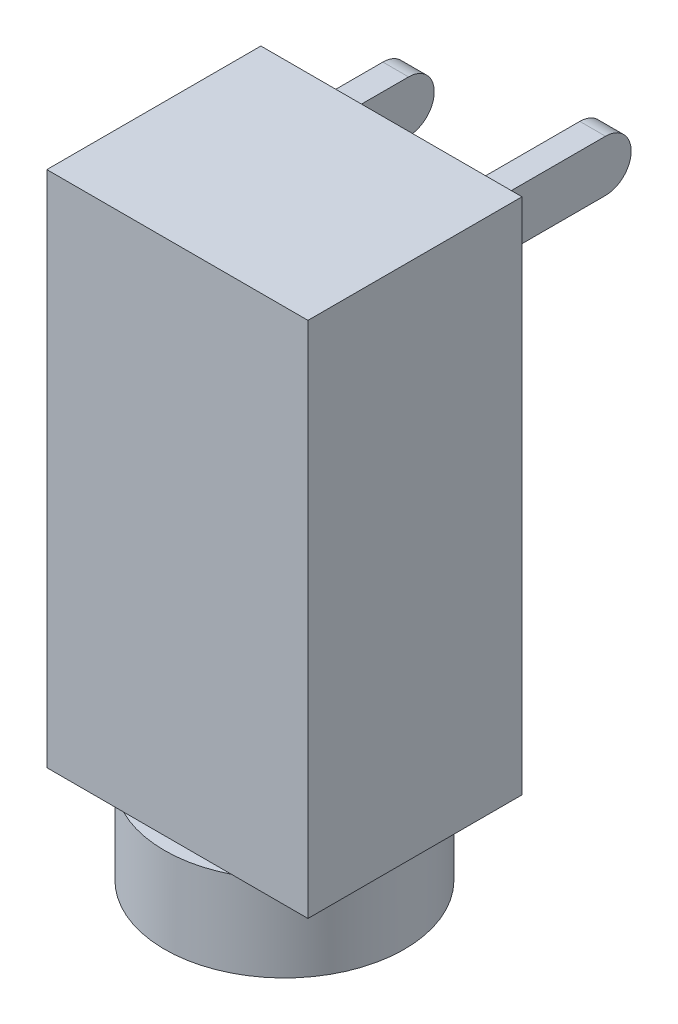
ISO-10303-21;
HEADER;
FILE_DESCRIPTION(('STEP AP214'),'2;1');
FILE_NAME('part.step','',(''),(''),'','','');
FILE_SCHEMA(('AUTOMOTIVE_DESIGN { 1 0 10303 214 1 1 1 1 }'));
ENDSEC;
DATA;
#1=APPLICATION_CONTEXT('core data for automotive mechanical design processes');
#2=APPLICATION_PROTOCOL_DEFINITION('international standard','automotive_design',2000,#1);
#3=PRODUCT_CONTEXT('',#1,'mechanical');
#4=PRODUCT('Part','Part','',(#3));
#5=PRODUCT_RELATED_PRODUCT_CATEGORY('part','',(#4));
#6=PRODUCT_DEFINITION_FORMATION('','',#4);
#7=PRODUCT_DEFINITION_CONTEXT('part definition',#1,'design');
#8=PRODUCT_DEFINITION('design','',#6,#7);
#9=PRODUCT_DEFINITION_SHAPE('','',#8);
#10=(LENGTH_UNIT() NAMED_UNIT(*) SI_UNIT(.MILLI.,.METRE.));
#11=(NAMED_UNIT(*) PLANE_ANGLE_UNIT() SI_UNIT($,.RADIAN.));
#12=(NAMED_UNIT(*) SI_UNIT($,.STERADIAN.) SOLID_ANGLE_UNIT());
#13=UNCERTAINTY_MEASURE_WITH_UNIT(LENGTH_MEASURE(1.E-05),#10,'distance_accuracy_value','');
#14=(GEOMETRIC_REPRESENTATION_CONTEXT(3) GLOBAL_UNCERTAINTY_ASSIGNED_CONTEXT((#13)) GLOBAL_UNIT_ASSIGNED_CONTEXT((#10,
#11,#12)) REPRESENTATION_CONTEXT('',''));
#15=CARTESIAN_POINT('',(0.,0.,0.));
#16=DIRECTION('',(0.,0.,1.));
#17=DIRECTION('',(1.,0.,0.));
#18=AXIS2_PLACEMENT_3D('',#15,#16,#17);
#19=CARTESIAN_POINT('',(0.,0.,0.));
#20=DIRECTION('',(0.,0.,1.));
#21=DIRECTION('',(1.,0.,0.));
#22=AXIS2_PLACEMENT_3D('',#19,#20,#21);
#23=PLANE('',#22);
#24=DIRECTION('',(0.,1.,0.));
#25=VECTOR('',#24,1.);
#26=CARTESIAN_POINT('',(-2.6,4.75,0.));
#27=LINE('',#26,#25);
#28=CARTESIAN_POINT('',(-2.6,3.55,0.));
#29=VERTEX_POINT('',#28);
#30=CARTESIAN_POINT('',(-2.6,4.75,0.));
#31=VERTEX_POINT('',#30);
#32=EDGE_CURVE('E240',#29,#31,#27,.T.);
#33=ORIENTED_EDGE('',*,*,#32,.F.);
#34=DIRECTION('',(-1.,0.,0.));
#35=VECTOR('',#34,1.);
#36=CARTESIAN_POINT('',(-2.,3.55,0.));
#37=LINE('',#36,#35);
#38=CARTESIAN_POINT('',(-2.,3.55,0.));
#39=VERTEX_POINT('',#38);
#40=EDGE_CURVE('E249',#39,#29,#37,.T.);
#41=ORIENTED_EDGE('',*,*,#40,.F.);
#42=DIRECTION('',(0.,-1.,0.));
#43=VECTOR('',#42,1.);
#44=CARTESIAN_POINT('',(-2.,4.75,0.));
#45=LINE('',#44,#43);
#46=CARTESIAN_POINT('',(-2.,4.75,0.));
#47=VERTEX_POINT('',#46);
#48=EDGE_CURVE('E246',#47,#39,#45,.T.);
#49=ORIENTED_EDGE('',*,*,#48,.F.);
#50=DIRECTION('',(1.,0.,0.));
#51=VECTOR('',#50,1.);
#52=CARTESIAN_POINT('',(-2.,4.75,0.));
#53=LINE('',#52,#51);
#54=EDGE_CURVE('E243',#31,#47,#53,.T.);
#55=ORIENTED_EDGE('',*,*,#54,.F.);
#56=EDGE_LOOP('',(#33,#41,#49,#55));
#57=FACE_BOUND('',#56,.T.);
#58=DIRECTION('',(0.,1.,0.));
#59=VECTOR('',#58,1.);
#60=CARTESIAN_POINT('',(-2.6,-2.25,0.));
#61=LINE('',#60,#59);
#62=CARTESIAN_POINT('',(-2.6,-3.45,0.));
#63=VERTEX_POINT('',#62);
#64=CARTESIAN_POINT('',(-2.6,-2.25,0.));
#65=VERTEX_POINT('',#64);
#66=EDGE_CURVE('E280',#63,#65,#61,.T.);
#67=ORIENTED_EDGE('',*,*,#66,.F.);
#68=DIRECTION('',(-1.,0.,0.));
#69=VECTOR('',#68,1.);
#70=CARTESIAN_POINT('',(-2.,-3.45,0.));
#71=LINE('',#70,#69);
#72=CARTESIAN_POINT('',(-2.,-3.45,0.));
#73=VERTEX_POINT('',#72);
#74=EDGE_CURVE('E289',#73,#63,#71,.T.);
#75=ORIENTED_EDGE('',*,*,#74,.F.);
#76=DIRECTION('',(0.,-1.,0.));
#77=VECTOR('',#76,1.);
#78=CARTESIAN_POINT('',(-2.,-2.25,0.));
#79=LINE('',#78,#77);
#80=CARTESIAN_POINT('',(-2.,-2.25,0.));
#81=VERTEX_POINT('',#80);
#82=EDGE_CURVE('E286',#81,#73,#79,.T.);
#83=ORIENTED_EDGE('',*,*,#82,.F.);
#84=DIRECTION('',(1.,0.,0.));
#85=VECTOR('',#84,1.);
#86=CARTESIAN_POINT('',(-2.,-2.25,0.));
#87=LINE('',#86,#85);
#88=EDGE_CURVE('E283',#65,#81,#87,.T.);
#89=ORIENTED_EDGE('',*,*,#88,.F.);
#90=EDGE_LOOP('',(#67,#75,#83,#89));
#91=FACE_BOUND('',#90,.T.);
#92=CARTESIAN_POINT('',(0.,2.55,0.));
#93=DIRECTION('',(0.,0.,1.));
#94=DIRECTION('',(1.,0.,0.));
#95=AXIS2_PLACEMENT_3D('',#92,#93,#94);
#96=CIRCLE('',#95,0.75);
#97=CARTESIAN_POINT('',(0.75,2.55,0.));
#98=VERTEX_POINT('',#97);
#99=EDGE_CURVE('E359',#98,#98,#96,.F.);
#100=ORIENTED_EDGE('',*,*,#99,.F.);
#101=EDGE_LOOP('',(#100));
#102=FACE_BOUND('',#101,.T.);
#103=CARTESIAN_POINT('',(0.,-4.45,0.));
#104=DIRECTION('',(0.,0.,1.));
#105=DIRECTION('',(1.,0.,0.));
#106=AXIS2_PLACEMENT_3D('',#103,#104,#105);
#107=CIRCLE('',#106,0.75);
#108=CARTESIAN_POINT('',(0.75,-4.45,0.));
#109=VERTEX_POINT('',#108);
#110=EDGE_CURVE('E356',#109,#109,#107,.F.);
#111=ORIENTED_EDGE('',*,*,#110,.F.);
#112=EDGE_LOOP('',(#111));
#113=FACE_BOUND('',#112,.T.);
#114=DIRECTION('',(0.,1.,0.));
#115=VECTOR('',#114,1.);
#116=CARTESIAN_POINT('',(3.05,6.05,0.));
#117=LINE('',#116,#115);
#118=CARTESIAN_POINT('',(3.05,-6.05,0.));
#119=VERTEX_POINT('',#118);
#120=CARTESIAN_POINT('',(3.05,6.05,0.));
#121=VERTEX_POINT('',#120);
#122=EDGE_CURVE('E316',#119,#121,#117,.T.);
#123=ORIENTED_EDGE('',*,*,#122,.F.);
#124=DIRECTION('',(1.,0.,0.));
#125=VECTOR('',#124,1.);
#126=CARTESIAN_POINT('',(-3.05,-6.05,0.));
#127=LINE('',#126,#125);
#128=CARTESIAN_POINT('',(1.26095202129185,-6.05,0.));
#129=VERTEX_POINT('',#128);
#130=EDGE_CURVE('E342',#129,#119,#127,.T.);
#131=ORIENTED_EDGE('',*,*,#130,.F.);
#132=CARTESIAN_POINT('',(-1.26095202129185,-6.05,0.));
#133=VERTEX_POINT('',#132);
#134=EDGE_CURVE('E344',#133,#129,#127,.T.);
#135=ORIENTED_EDGE('',*,*,#134,.F.);
#136=CARTESIAN_POINT('',(-3.05,-6.05,0.));
#137=VERTEX_POINT('',#136);
#138=EDGE_CURVE('E326',#137,#133,#127,.T.);
#139=ORIENTED_EDGE('',*,*,#138,.F.);
#140=DIRECTION('',(0.,-1.,0.));
#141=VECTOR('',#140,1.);
#142=CARTESIAN_POINT('',(-3.05,6.05,0.));
#143=LINE('',#142,#141);
#144=CARTESIAN_POINT('',(-3.05,6.05,0.));
#145=VERTEX_POINT('',#144);
#146=EDGE_CURVE('E340',#145,#137,#143,.T.);
#147=ORIENTED_EDGE('',*,*,#146,.F.);
#148=DIRECTION('',(-1.,0.,0.));
#149=VECTOR('',#148,1.);
#150=CARTESIAN_POINT('',(-3.05,6.05,0.));
#151=LINE('',#150,#149);
#152=EDGE_CURVE('E338',#121,#145,#151,.T.);
#153=ORIENTED_EDGE('',*,*,#152,.F.);
#154=EDGE_LOOP('',(#123,#131,#135,#139,#147,#153));
#155=FACE_BOUND('',#154,.T.);
#156=DIRECTION('',(0.,1.,0.));
#157=VECTOR('',#156,1.);
#158=CARTESIAN_POINT('',(-2.6,0.750000000000001,0.));
#159=LINE('',#158,#157);
#160=CARTESIAN_POINT('',(-2.6,-0.449999999999999,0.));
#161=VERTEX_POINT('',#160);
#162=CARTESIAN_POINT('',(-2.6,0.750000000000001,0.));
#163=VERTEX_POINT('',#162);
#164=EDGE_CURVE('E260',#161,#163,#159,.T.);
#165=ORIENTED_EDGE('',*,*,#164,.F.);
#166=DIRECTION('',(-1.,0.,0.));
#167=VECTOR('',#166,1.);
#168=CARTESIAN_POINT('',(-2.,-0.449999999999999,0.));
#169=LINE('',#168,#167);
#170=CARTESIAN_POINT('',(-2.,-0.449999999999999,0.));
#171=VERTEX_POINT('',#170);
#172=EDGE_CURVE('E269',#171,#161,#169,.T.);
#173=ORIENTED_EDGE('',*,*,#172,.F.);
#174=DIRECTION('',(0.,-1.,0.));
#175=VECTOR('',#174,1.);
#176=CARTESIAN_POINT('',(-2.,0.750000000000001,0.));
#177=LINE('',#176,#175);
#178=CARTESIAN_POINT('',(-2.,0.750000000000001,0.));
#179=VERTEX_POINT('',#178);
#180=EDGE_CURVE('E266',#179,#171,#177,.T.);
#181=ORIENTED_EDGE('',*,*,#180,.F.);
#182=DIRECTION('',(1.,0.,0.));
#183=VECTOR('',#182,1.);
#184=CARTESIAN_POINT('',(-2.,0.750000000000001,0.));
#185=LINE('',#184,#183);
#186=EDGE_CURVE('E263',#163,#179,#185,.T.);
#187=ORIENTED_EDGE('',*,*,#186,.F.);
#188=EDGE_LOOP('',(#165,#173,#181,#187));
#189=FACE_BOUND('',#188,.T.);
#190=DIRECTION('',(0.,1.,0.));
#191=VECTOR('',#190,1.);
#192=CARTESIAN_POINT('',(2.,5.85,0.));
#193=LINE('',#192,#191);
#194=CARTESIAN_POINT('',(2.,4.65,0.));
#195=VERTEX_POINT('',#194);
#196=CARTESIAN_POINT('',(2.,5.85,0.));
#197=VERTEX_POINT('',#196);
#198=EDGE_CURVE('E210',#195,#197,#193,.T.);
#199=ORIENTED_EDGE('',*,*,#198,.F.);
#200=DIRECTION('',(-1.,0.,0.));
#201=VECTOR('',#200,1.);
#202=CARTESIAN_POINT('',(2.6,4.65,0.));
#203=LINE('',#202,#201);
#204=CARTESIAN_POINT('',(2.6,4.65,0.));
#205=VERTEX_POINT('',#204);
#206=EDGE_CURVE('E217',#205,#195,#203,.T.);
#207=ORIENTED_EDGE('',*,*,#206,.F.);
#208=DIRECTION('',(0.,-1.,0.));
#209=VECTOR('',#208,1.);
#210=CARTESIAN_POINT('',(2.6,5.85,0.));
#211=LINE('',#210,#209);
#212=CARTESIAN_POINT('',(2.6,5.85,0.));
#213=VERTEX_POINT('',#212);
#214=EDGE_CURVE('E230',#213,#205,#211,.T.);
#215=ORIENTED_EDGE('',*,*,#214,.F.);
#216=DIRECTION('',(1.,0.,0.));
#217=VECTOR('',#216,1.);
#218=CARTESIAN_POINT('',(2.6,5.85,0.));
#219=LINE('',#218,#217);
#220=EDGE_CURVE('E225',#197,#213,#219,.T.);
#221=ORIENTED_EDGE('',*,*,#220,.F.);
#222=EDGE_LOOP('',(#199,#207,#215,#221));
#223=FACE_BOUND('',#222,.T.);
#224=ADVANCED_FACE('F35',(#57,#91,#102,#113,#155,#189,#223),#23,.F.);
#225=CARTESIAN_POINT('',(-3.05,-6.05,5.));
#226=DIRECTION('',(0.,1.,0.));
#227=DIRECTION('',(0.,0.,1.));
#228=AXIS2_PLACEMENT_3D('',#225,#226,#227);
#229=PLANE('',#228);
#230=CARTESIAN_POINT('',(0.,-6.05,2.5));
#231=DIRECTION('',(0.,-1.,0.));
#232=DIRECTION('',(0.,0.,-1.));
#233=AXIS2_PLACEMENT_3D('',#230,#231,#232);
#234=CIRCLE('',#233,2.8);
#235=CARTESIAN_POINT('',(1.26095202129185,-6.05,5.));
#236=VERTEX_POINT('',#235);
#237=EDGE_CURVE('E317',#129,#236,#234,.T.);
#238=ORIENTED_EDGE('',*,*,#237,.F.);
#239=ORIENTED_EDGE('',*,*,#130,.T.);
#240=DIRECTION('',(0.,0.,-1.));
#241=VECTOR('',#240,1.);
#242=CARTESIAN_POINT('',(3.05,-6.05,5.));
#243=LINE('',#242,#241);
#244=CARTESIAN_POINT('',(3.05,-6.05,5.));
#245=VERTEX_POINT('',#244);
#246=EDGE_CURVE('E334',#245,#119,#243,.T.);
#247=ORIENTED_EDGE('',*,*,#246,.F.);
#248=DIRECTION('',(1.,0.,0.));
#249=VECTOR('',#248,1.);
#250=CARTESIAN_POINT('',(-3.05,-6.05,5.));
#251=LINE('',#250,#249);
#252=EDGE_CURVE('E330',#236,#245,#251,.T.);
#253=ORIENTED_EDGE('',*,*,#252,.F.);
#254=EDGE_LOOP('',(#238,#239,#247,#253));
#255=FACE_BOUND('',#254,.T.);
#256=ADVANCED_FACE('F454',(#255),#229,.F.);
#257=CARTESIAN_POINT('',(3.05,6.05,5.));
#258=DIRECTION('',(-1.,0.,0.));
#259=DIRECTION('',(0.,-1.,0.));
#260=AXIS2_PLACEMENT_3D('',#257,#258,#259);
#261=PLANE('',#260);
#262=ORIENTED_EDGE('',*,*,#122,.T.);
#263=DIRECTION('',(0.,0.,-1.));
#264=VECTOR('',#263,1.);
#265=CARTESIAN_POINT('',(3.05,6.05,5.));
#266=LINE('',#265,#264);
#267=CARTESIAN_POINT('',(3.05,6.05,5.));
#268=VERTEX_POINT('',#267);
#269=EDGE_CURVE('E353',#268,#121,#266,.T.);
#270=ORIENTED_EDGE('',*,*,#269,.F.);
#271=DIRECTION('',(0.,1.,0.));
#272=VECTOR('',#271,1.);
#273=CARTESIAN_POINT('',(3.05,6.05,5.));
#274=LINE('',#273,#272);
#275=EDGE_CURVE('E322',#245,#268,#274,.T.);
#276=ORIENTED_EDGE('',*,*,#275,.F.);
#277=ORIENTED_EDGE('',*,*,#246,.T.);
#278=EDGE_LOOP('',(#262,#270,#276,#277));
#279=FACE_BOUND('',#278,.T.);
#280=ADVANCED_FACE('F460',(#279),#261,.F.);
#281=CARTESIAN_POINT('',(-3.05,6.05,5.));
#282=DIRECTION('',(0.,-1.,0.));
#283=DIRECTION('',(0.,0.,-1.));
#284=AXIS2_PLACEMENT_3D('',#281,#282,#283);
#285=PLANE('',#284);
#286=ORIENTED_EDGE('',*,*,#152,.T.);
#287=DIRECTION('',(0.,0.,-1.));
#288=VECTOR('',#287,1.);
#289=CARTESIAN_POINT('',(-3.05,6.05,5.));
#290=LINE('',#289,#288);
#291=CARTESIAN_POINT('',(-3.05,6.05,5.));
#292=VERTEX_POINT('',#291);
#293=EDGE_CURVE('E350',#292,#145,#290,.T.);
#294=ORIENTED_EDGE('',*,*,#293,.F.);
#295=DIRECTION('',(-1.,0.,0.));
#296=VECTOR('',#295,1.);
#297=CARTESIAN_POINT('',(-3.05,6.05,5.));
#298=LINE('',#297,#296);
#299=EDGE_CURVE('E325',#268,#292,#298,.T.);
#300=ORIENTED_EDGE('',*,*,#299,.F.);
#301=ORIENTED_EDGE('',*,*,#269,.T.);
#302=EDGE_LOOP('',(#286,#294,#300,#301));
#303=FACE_BOUND('',#302,.T.);
#304=ADVANCED_FACE('F475',(#303),#285,.F.);
#305=CARTESIAN_POINT('',(-3.05,6.05,5.));
#306=DIRECTION('',(1.,0.,0.));
#307=DIRECTION('',(0.,1.,0.));
#308=AXIS2_PLACEMENT_3D('',#305,#306,#307);
#309=PLANE('',#308);
#310=ORIENTED_EDGE('',*,*,#146,.T.);
#311=DIRECTION('',(0.,0.,-1.));
#312=VECTOR('',#311,1.);
#313=CARTESIAN_POINT('',(-3.05,-6.05,5.));
#314=LINE('',#313,#312);
#315=CARTESIAN_POINT('',(-3.05,-6.05,5.));
#316=VERTEX_POINT('',#315);
#317=EDGE_CURVE('E347',#316,#137,#314,.T.);
#318=ORIENTED_EDGE('',*,*,#317,.F.);
#319=DIRECTION('',(0.,-1.,0.));
#320=VECTOR('',#319,1.);
#321=CARTESIAN_POINT('',(-3.05,6.05,5.));
#322=LINE('',#321,#320);
#323=EDGE_CURVE('E328',#292,#316,#322,.T.);
#324=ORIENTED_EDGE('',*,*,#323,.F.);
#325=ORIENTED_EDGE('',*,*,#293,.T.);
#326=EDGE_LOOP('',(#310,#318,#324,#325));
#327=FACE_BOUND('',#326,.T.);
#328=ADVANCED_FACE('F471',(#327),#309,.F.);
#329=CARTESIAN_POINT('',(-1.26095202129185,-6.05,5.));
#330=VERTEX_POINT('',#329);
#331=EDGE_CURVE('E321',#330,#133,#234,.T.);
#332=ORIENTED_EDGE('',*,*,#331,.F.);
#333=EDGE_CURVE('E331',#316,#330,#251,.T.);
#334=ORIENTED_EDGE('',*,*,#333,.F.);
#335=ORIENTED_EDGE('',*,*,#317,.T.);
#336=ORIENTED_EDGE('',*,*,#138,.T.);
#337=EDGE_LOOP('',(#332,#334,#335,#336));
#338=FACE_BOUND('',#337,.T.);
#339=ADVANCED_FACE('F464',(#338),#229,.F.);
#340=CARTESIAN_POINT('',(0.,0.,5.));
#341=DIRECTION('',(0.,0.,1.));
#342=DIRECTION('',(1.,0.,0.));
#343=AXIS2_PLACEMENT_3D('',#340,#341,#342);
#344=PLANE('',#343);
#345=ORIENTED_EDGE('',*,*,#275,.T.);
#346=ORIENTED_EDGE('',*,*,#299,.T.);
#347=ORIENTED_EDGE('',*,*,#323,.T.);
#348=ORIENTED_EDGE('',*,*,#333,.T.);
#349=EDGE_CURVE('E335',#330,#236,#251,.T.);
#350=ORIENTED_EDGE('',*,*,#349,.T.);
#351=ORIENTED_EDGE('',*,*,#252,.T.);
#352=EDGE_LOOP('',(#345,#346,#347,#348,#350,#351));
#353=FACE_BOUND('',#352,.T.);
#354=ADVANCED_FACE('F467',(#353),#344,.T.);
#355=CARTESIAN_POINT('',(0.,-6.05,2.5));
#356=DIRECTION('',(0.,-1.,0.));
#357=DIRECTION('',(0.,0.,-1.));
#358=AXIS2_PLACEMENT_3D('',#355,#356,#357);
#359=PLANE('',#358);
#360=EDGE_CURVE('E310',#133,#129,#234,.T.);
#361=ORIENTED_EDGE('',*,*,#360,.F.);
#362=ORIENTED_EDGE('',*,*,#134,.T.);
#363=EDGE_LOOP('',(#361,#362));
#364=FACE_BOUND('',#363,.T.);
#365=ADVANCED_FACE('F729',(#364),#359,.F.);
#366=CARTESIAN_POINT('',(0.,-8.05,2.5));
#367=DIRECTION('',(0.,-1.,0.));
#368=DIRECTION('',(0.,0.,-1.));
#369=AXIS2_PLACEMENT_3D('',#366,#367,#368);
#370=PLANE('',#369);
#371=CARTESIAN_POINT('',(0.,-8.05,2.5));
#372=DIRECTION('',(0.,-1.,0.));
#373=DIRECTION('',(0.,0.,-1.));
#374=AXIS2_PLACEMENT_3D('',#371,#372,#373);
#375=CIRCLE('',#374,2.8);
#376=CARTESIAN_POINT('',(0.,-8.05,-0.3));
#377=VERTEX_POINT('',#376);
#378=EDGE_CURVE('E313',#377,#377,#375,.T.);
#379=ORIENTED_EDGE('',*,*,#378,.T.);
#380=EDGE_LOOP('',(#379));
#381=FACE_BOUND('',#380,.T.);
#382=CARTESIAN_POINT('',(0.,-8.05,2.5));
#383=DIRECTION('',(0.,-1.,0.));
#384=DIRECTION('',(0.,0.,-1.));
#385=AXIS2_PLACEMENT_3D('',#382,#383,#384);
#386=CIRCLE('',#385,1.8);
#387=CARTESIAN_POINT('',(0.,-8.05,0.7));
#388=VERTEX_POINT('',#387);
#389=EDGE_CURVE('E307',#388,#388,#386,.T.);
#390=ORIENTED_EDGE('',*,*,#389,.F.);
#391=EDGE_LOOP('',(#390));
#392=FACE_BOUND('',#391,.T.);
#393=ADVANCED_FACE('F726',(#381,#392),#370,.T.);
#394=ORIENTED_EDGE('',*,*,#349,.F.);
#395=EDGE_CURVE('E320',#236,#330,#234,.T.);
#396=ORIENTED_EDGE('',*,*,#395,.F.);
#397=EDGE_LOOP('',(#394,#396));
#398=FACE_BOUND('',#397,.T.);
#399=ADVANCED_FACE('F717',(#398),#359,.F.);
#400=CARTESIAN_POINT('',(0.,-8.05,2.5));
#401=DIRECTION('',(0.,1.,0.));
#402=DIRECTION('',(0.,0.,1.));
#403=AXIS2_PLACEMENT_3D('',#400,#401,#402);
#404=CYLINDRICAL_SURFACE('',#403,2.8);
#405=ORIENTED_EDGE('',*,*,#378,.F.);
#406=EDGE_LOOP('',(#405));
#407=FACE_BOUND('',#406,.T.);
#408=ORIENTED_EDGE('',*,*,#237,.T.);
#409=ORIENTED_EDGE('',*,*,#395,.T.);
#410=ORIENTED_EDGE('',*,*,#331,.T.);
#411=ORIENTED_EDGE('',*,*,#360,.T.);
#412=EDGE_LOOP('',(#408,#409,#410,#411));
#413=FACE_BOUND('',#412,.T.);
#414=ADVANCED_FACE('F706',(#407,#413),#404,.T.);
#415=CARTESIAN_POINT('',(0.,-8.05,2.5));
#416=DIRECTION('',(0.,1.,0.));
#417=DIRECTION('',(0.,0.,1.));
#418=AXIS2_PLACEMENT_3D('',#415,#416,#417);
#419=CYLINDRICAL_SURFACE('',#418,1.8);
#420=ORIENTED_EDGE('',*,*,#389,.T.);
#421=EDGE_LOOP('',(#420));
#422=FACE_BOUND('',#421,.T.);
#423=CARTESIAN_POINT('',(0.,-6.05,2.5));
#424=DIRECTION('',(0.,-1.,0.));
#425=DIRECTION('',(0.,0.,-1.));
#426=AXIS2_PLACEMENT_3D('',#423,#424,#425);
#427=CIRCLE('',#426,1.8);
#428=CARTESIAN_POINT('',(0.,-6.05,0.7));
#429=VERTEX_POINT('',#428);
#430=EDGE_CURVE('E306',#429,#429,#427,.T.);
#431=ORIENTED_EDGE('',*,*,#430,.F.);
#432=EDGE_LOOP('',(#431));
#433=FACE_BOUND('',#432,.T.);
#434=ADVANCED_FACE('F696',(#422,#433),#419,.F.);
#435=ORIENTED_EDGE('',*,*,#430,.T.);
#436=EDGE_LOOP('',(#435));
#437=FACE_BOUND('',#436,.T.);
#438=ADVANCED_FACE('F463',(#437),#229,.F.);
#439=CARTESIAN_POINT('',(0.,-4.45,-1.));
#440=DIRECTION('',(0.,0.,1.));
#441=DIRECTION('',(1.,0.,0.));
#442=AXIS2_PLACEMENT_3D('',#439,#440,#441);
#443=CYLINDRICAL_SURFACE('',#442,0.75);
#444=CARTESIAN_POINT('',(0.,-4.45,-1.));
#445=DIRECTION('',(0.,0.,-1.));
#446=DIRECTION('',(-1.,0.,0.));
#447=AXIS2_PLACEMENT_3D('',#444,#445,#446);
#448=CIRCLE('',#447,0.75);
#449=CARTESIAN_POINT('',(-0.75,-4.45,-1.));
#450=VERTEX_POINT('',#449);
#451=EDGE_CURVE('E303',#450,#450,#448,.T.);
#452=ORIENTED_EDGE('',*,*,#451,.F.);
#453=EDGE_LOOP('',(#452));
#454=FACE_BOUND('',#453,.T.);
#455=ORIENTED_EDGE('',*,*,#110,.T.);
#456=EDGE_LOOP('',(#455));
#457=FACE_BOUND('',#456,.T.);
#458=ADVANCED_FACE('F676',(#454,#457),#443,.T.);
#459=CARTESIAN_POINT('',(0.,-4.45,-1.));
#460=DIRECTION('',(0.,0.,-1.));
#461=DIRECTION('',(-1.,0.,0.));
#462=AXIS2_PLACEMENT_3D('',#459,#460,#461);
#463=PLANE('',#462);
#464=ORIENTED_EDGE('',*,*,#451,.T.);
#465=EDGE_LOOP('',(#464));
#466=FACE_BOUND('',#465,.T.);
#467=ADVANCED_FACE('F666',(#466),#463,.T.);
#468=CARTESIAN_POINT('',(0.,2.55,-1.));
#469=DIRECTION('',(0.,0.,1.));
#470=DIRECTION('',(1.,0.,0.));
#471=AXIS2_PLACEMENT_3D('',#468,#469,#470);
#472=CYLINDRICAL_SURFACE('',#471,0.75);
#473=CARTESIAN_POINT('',(0.,2.55,-1.));
#474=DIRECTION('',(0.,0.,-1.));
#475=DIRECTION('',(-1.,0.,0.));
#476=AXIS2_PLACEMENT_3D('',#473,#474,#475);
#477=CIRCLE('',#476,0.75);
#478=CARTESIAN_POINT('',(-0.75,2.55,-1.));
#479=VERTEX_POINT('',#478);
#480=EDGE_CURVE('E300',#479,#479,#477,.T.);
#481=ORIENTED_EDGE('',*,*,#480,.F.);
#482=EDGE_LOOP('',(#481));
#483=FACE_BOUND('',#482,.T.);
#484=ORIENTED_EDGE('',*,*,#99,.T.);
#485=EDGE_LOOP('',(#484));
#486=FACE_BOUND('',#485,.T.);
#487=ADVANCED_FACE('F450',(#483,#486),#472,.T.);
#488=CARTESIAN_POINT('',(0.,2.55,-1.));
#489=DIRECTION('',(0.,0.,-1.));
#490=DIRECTION('',(-1.,0.,0.));
#491=AXIS2_PLACEMENT_3D('',#488,#489,#490);
#492=PLANE('',#491);
#493=ORIENTED_EDGE('',*,*,#480,.T.);
#494=EDGE_LOOP('',(#493));
#495=FACE_BOUND('',#494,.T.);
#496=ADVANCED_FACE('F443',(#495),#492,.T.);
#497=CARTESIAN_POINT('',(-2.6,-2.25,-3.));
#498=DIRECTION('',(1.,0.,0.));
#499=DIRECTION('',(0.,0.,-1.));
#500=AXIS2_PLACEMENT_3D('',#497,#498,#499);
#501=PLANE('',#500);
#502=DIRECTION('',(0.,0.,1.));
#503=VECTOR('',#502,1.);
#504=CARTESIAN_POINT('',(-2.6,-2.25,-3.));
#505=LINE('',#504,#503);
#506=CARTESIAN_POINT('',(-2.6,-2.25,-2.4));
#507=VERTEX_POINT('',#506);
#508=EDGE_CURVE('E298',#507,#65,#505,.T.);
#509=ORIENTED_EDGE('',*,*,#508,.F.);
#510=CARTESIAN_POINT('',(-2.6,-2.85,-2.4));
#511=DIRECTION('',(1.,0.,0.));
#512=DIRECTION('',(0.,0.,-1.));
#513=AXIS2_PLACEMENT_3D('',#510,#511,#512);
#514=CIRCLE('',#513,0.6);
#515=CARTESIAN_POINT('',(-2.6,-2.85,-3.));
#516=VERTEX_POINT('',#515);
#517=EDGE_CURVE('E44',#507,#516,#514,.F.);
#518=ORIENTED_EDGE('',*,*,#517,.T.);
#519=CARTESIAN_POINT('',(-2.6,-2.85,-2.4));
#520=DIRECTION('',(1.,0.,0.));
#521=DIRECTION('',(0.,0.,-1.));
#522=AXIS2_PLACEMENT_3D('',#519,#520,#521);
#523=CIRCLE('',#522,0.6);
#524=CARTESIAN_POINT('',(-2.6,-3.45,-2.4));
#525=VERTEX_POINT('',#524);
#526=EDGE_CURVE('E52',#516,#525,#523,.F.);
#527=ORIENTED_EDGE('',*,*,#526,.T.);
#528=DIRECTION('',(0.,0.,1.));
#529=VECTOR('',#528,1.);
#530=CARTESIAN_POINT('',(-2.6,-3.45,-3.));
#531=LINE('',#530,#529);
#532=EDGE_CURVE('E292',#525,#63,#531,.T.);
#533=ORIENTED_EDGE('',*,*,#532,.T.);
#534=ORIENTED_EDGE('',*,*,#66,.T.);
#535=EDGE_LOOP('',(#509,#518,#527,#533,#534));
#536=FACE_BOUND('',#535,.T.);
#537=ADVANCED_FACE('F441',(#536),#501,.F.);
#538=CARTESIAN_POINT('',(-2.,-2.25,-3.));
#539=DIRECTION('',(0.,-1.,0.));
#540=DIRECTION('',(0.,0.,-1.));
#541=AXIS2_PLACEMENT_3D('',#538,#539,#540);
#542=PLANE('',#541);
#543=DIRECTION('',(0.,0.,1.));
#544=VECTOR('',#543,1.);
#545=CARTESIAN_POINT('',(-2.,-2.25,-3.));
#546=LINE('',#545,#544);
#547=CARTESIAN_POINT('',(-2.,-2.25,-2.4));
#548=VERTEX_POINT('',#547);
#549=EDGE_CURVE('E296',#548,#81,#546,.T.);
#550=ORIENTED_EDGE('',*,*,#549,.F.);
#551=DIRECTION('',(1.,0.,0.));
#552=VECTOR('',#551,1.);
#553=CARTESIAN_POINT('',(-2.6,-2.25,-2.4));
#554=LINE('',#553,#552);
#555=EDGE_CURVE('E404',#548,#507,#554,.F.);
#556=ORIENTED_EDGE('',*,*,#555,.T.);
#557=ORIENTED_EDGE('',*,*,#508,.T.);
#558=ORIENTED_EDGE('',*,*,#88,.T.);
#559=EDGE_LOOP('',(#550,#556,#557,#558));
#560=FACE_BOUND('',#559,.T.);
#561=ADVANCED_FACE('F440',(#560),#542,.F.);
#562=CARTESIAN_POINT('',(-2.,-2.25,-3.));
#563=DIRECTION('',(-1.,0.,0.));
#564=DIRECTION('',(0.,0.,1.));
#565=AXIS2_PLACEMENT_3D('',#562,#563,#564);
#566=PLANE('',#565);
#567=CARTESIAN_POINT('',(-2.,-2.85,-2.4));
#568=DIRECTION('',(-1.,0.,0.));
#569=DIRECTION('',(0.,0.,1.));
#570=AXIS2_PLACEMENT_3D('',#567,#568,#569);
#571=CIRCLE('',#570,0.6);
#572=CARTESIAN_POINT('',(-2.,-3.45,-2.4));
#573=VERTEX_POINT('',#572);
#574=CARTESIAN_POINT('',(-2.,-2.85,-3.));
#575=VERTEX_POINT('',#574);
#576=EDGE_CURVE('E400',#573,#575,#571,.F.);
#577=ORIENTED_EDGE('',*,*,#576,.T.);
#578=CARTESIAN_POINT('',(-2.,-2.85,-2.4));
#579=DIRECTION('',(-1.,0.,0.));
#580=DIRECTION('',(0.,0.,1.));
#581=AXIS2_PLACEMENT_3D('',#578,#579,#580);
#582=CIRCLE('',#581,0.6);
#583=EDGE_CURVE('E402',#575,#548,#582,.F.);
#584=ORIENTED_EDGE('',*,*,#583,.T.);
#585=ORIENTED_EDGE('',*,*,#549,.T.);
#586=ORIENTED_EDGE('',*,*,#82,.T.);
#587=DIRECTION('',(0.,0.,1.));
#588=VECTOR('',#587,1.);
#589=CARTESIAN_POINT('',(-2.,-3.45,-3.));
#590=LINE('',#589,#588);
#591=EDGE_CURVE('E294',#573,#73,#590,.T.);
#592=ORIENTED_EDGE('',*,*,#591,.F.);
#593=EDGE_LOOP('',(#577,#584,#585,#586,#592));
#594=FACE_BOUND('',#593,.T.);
#595=ADVANCED_FACE('F432',(#594),#566,.F.);
#596=CARTESIAN_POINT('',(-2.,-3.45,-3.));
#597=DIRECTION('',(0.,1.,0.));
#598=DIRECTION('',(0.,0.,1.));
#599=AXIS2_PLACEMENT_3D('',#596,#597,#598);
#600=PLANE('',#599);
#601=ORIENTED_EDGE('',*,*,#532,.F.);
#602=DIRECTION('',(-1.,0.,0.));
#603=VECTOR('',#602,1.);
#604=CARTESIAN_POINT('',(-2.,-3.45,-2.4));
#605=LINE('',#604,#603);
#606=EDGE_CURVE('E11',#525,#573,#605,.F.);
#607=ORIENTED_EDGE('',*,*,#606,.T.);
#608=ORIENTED_EDGE('',*,*,#591,.T.);
#609=ORIENTED_EDGE('',*,*,#74,.T.);
#610=EDGE_LOOP('',(#601,#607,#608,#609));
#611=FACE_BOUND('',#610,.T.);
#612=ADVANCED_FACE('F429',(#611),#600,.F.);
#613=CARTESIAN_POINT('',(-2.6,0.750000000000001,-3.));
#614=DIRECTION('',(1.,0.,0.));
#615=DIRECTION('',(0.,0.,-1.));
#616=AXIS2_PLACEMENT_3D('',#613,#614,#615);
#617=PLANE('',#616);
#618=DIRECTION('',(0.,0.,1.));
#619=VECTOR('',#618,1.);
#620=CARTESIAN_POINT('',(-2.6,0.750000000000001,-3.));
#621=LINE('',#620,#619);
#622=CARTESIAN_POINT('',(-2.6,0.750000000000001,-2.4));
#623=VERTEX_POINT('',#622);
#624=EDGE_CURVE('E278',#623,#163,#621,.T.);
#625=ORIENTED_EDGE('',*,*,#624,.F.);
#626=CARTESIAN_POINT('',(-2.6,0.150000000000001,-2.4));
#627=DIRECTION('',(1.,0.,0.));
#628=DIRECTION('',(0.,0.,-1.));
#629=AXIS2_PLACEMENT_3D('',#626,#627,#628);
#630=CIRCLE('',#629,0.6);
#631=CARTESIAN_POINT('',(-2.6,0.150000000000001,-3.));
#632=VERTEX_POINT('',#631);
#633=EDGE_CURVE('E396',#623,#632,#630,.F.);
#634=ORIENTED_EDGE('',*,*,#633,.T.);
#635=CARTESIAN_POINT('',(-2.6,0.150000000000001,-2.4));
#636=DIRECTION('',(1.,0.,0.));
#637=DIRECTION('',(0.,0.,-1.));
#638=AXIS2_PLACEMENT_3D('',#635,#636,#637);
#639=CIRCLE('',#638,0.6);
#640=CARTESIAN_POINT('',(-2.6,-0.449999999999999,-2.4));
#641=VERTEX_POINT('',#640);
#642=EDGE_CURVE('E394',#632,#641,#639,.F.);
#643=ORIENTED_EDGE('',*,*,#642,.T.);
#644=DIRECTION('',(0.,0.,1.));
#645=VECTOR('',#644,1.);
#646=CARTESIAN_POINT('',(-2.6,-0.449999999999999,-3.));
#647=LINE('',#646,#645);
#648=EDGE_CURVE('E272',#641,#161,#647,.T.);
#649=ORIENTED_EDGE('',*,*,#648,.T.);
#650=ORIENTED_EDGE('',*,*,#164,.T.);
#651=EDGE_LOOP('',(#625,#634,#643,#649,#650));
#652=FACE_BOUND('',#651,.T.);
#653=ADVANCED_FACE('F618',(#652),#617,.F.);
#654=CARTESIAN_POINT('',(-2.,0.750000000000001,-3.));
#655=DIRECTION('',(0.,-1.,0.));
#656=DIRECTION('',(0.,0.,-1.));
#657=AXIS2_PLACEMENT_3D('',#654,#655,#656);
#658=PLANE('',#657);
#659=DIRECTION('',(0.,0.,1.));
#660=VECTOR('',#659,1.);
#661=CARTESIAN_POINT('',(-2.,0.750000000000001,-3.));
#662=LINE('',#661,#660);
#663=CARTESIAN_POINT('',(-2.,0.750000000000001,-2.4));
#664=VERTEX_POINT('',#663);
#665=EDGE_CURVE('E276',#664,#179,#662,.T.);
#666=ORIENTED_EDGE('',*,*,#665,.F.);
#667=DIRECTION('',(1.,0.,0.));
#668=VECTOR('',#667,1.);
#669=CARTESIAN_POINT('',(-2.6,0.750000000000001,-2.4));
#670=LINE('',#669,#668);
#671=EDGE_CURVE('E391',#664,#623,#670,.F.);
#672=ORIENTED_EDGE('',*,*,#671,.T.);
#673=ORIENTED_EDGE('',*,*,#624,.T.);
#674=ORIENTED_EDGE('',*,*,#186,.T.);
#675=EDGE_LOOP('',(#666,#672,#673,#674));
#676=FACE_BOUND('',#675,.T.);
#677=ADVANCED_FACE('F610',(#676),#658,.F.);
#678=CARTESIAN_POINT('',(-2.,0.750000000000001,-3.));
#679=DIRECTION('',(-1.,0.,0.));
#680=DIRECTION('',(0.,-1.,0.));
#681=AXIS2_PLACEMENT_3D('',#678,#679,#680);
#682=PLANE('',#681);
#683=CARTESIAN_POINT('',(-2.,0.150000000000001,-2.4));
#684=DIRECTION('',(-1.,0.,0.));
#685=DIRECTION('',(0.,-1.,0.));
#686=AXIS2_PLACEMENT_3D('',#683,#684,#685);
#687=CIRCLE('',#686,0.6);
#688=CARTESIAN_POINT('',(-2.,-0.449999999999999,-2.4));
#689=VERTEX_POINT('',#688);
#690=CARTESIAN_POINT('',(-2.,0.150000000000001,-3.));
#691=VERTEX_POINT('',#690);
#692=EDGE_CURVE('E387',#689,#691,#687,.F.);
#693=ORIENTED_EDGE('',*,*,#692,.T.);
#694=CARTESIAN_POINT('',(-2.,0.150000000000001,-2.4));
#695=DIRECTION('',(-1.,0.,0.));
#696=DIRECTION('',(0.,-1.,0.));
#697=AXIS2_PLACEMENT_3D('',#694,#695,#696);
#698=CIRCLE('',#697,0.6);
#699=EDGE_CURVE('E389',#691,#664,#698,.F.);
#700=ORIENTED_EDGE('',*,*,#699,.T.);
#701=ORIENTED_EDGE('',*,*,#665,.T.);
#702=ORIENTED_EDGE('',*,*,#180,.T.);
#703=DIRECTION('',(0.,0.,1.));
#704=VECTOR('',#703,1.);
#705=CARTESIAN_POINT('',(-2.,-0.449999999999999,-3.));
#706=LINE('',#705,#704);
#707=EDGE_CURVE('E274',#689,#171,#706,.T.);
#708=ORIENTED_EDGE('',*,*,#707,.F.);
#709=EDGE_LOOP('',(#693,#700,#701,#702,#708));
#710=FACE_BOUND('',#709,.T.);
#711=ADVANCED_FACE('F602',(#710),#682,.F.);
#712=CARTESIAN_POINT('',(-2.,-0.449999999999999,-3.));
#713=DIRECTION('',(0.,1.,0.));
#714=DIRECTION('',(0.,0.,1.));
#715=AXIS2_PLACEMENT_3D('',#712,#713,#714);
#716=PLANE('',#715);
#717=ORIENTED_EDGE('',*,*,#648,.F.);
#718=DIRECTION('',(-1.,0.,0.));
#719=VECTOR('',#718,1.);
#720=CARTESIAN_POINT('',(-2.,-0.449999999999999,-2.4));
#721=LINE('',#720,#719);
#722=EDGE_CURVE('E398',#641,#689,#721,.F.);
#723=ORIENTED_EDGE('',*,*,#722,.T.);
#724=ORIENTED_EDGE('',*,*,#707,.T.);
#725=ORIENTED_EDGE('',*,*,#172,.T.);
#726=EDGE_LOOP('',(#717,#723,#724,#725));
#727=FACE_BOUND('',#726,.T.);
#728=ADVANCED_FACE('F594',(#727),#716,.F.);
#729=CARTESIAN_POINT('',(-2.6,4.75,-3.));
#730=DIRECTION('',(1.,0.,0.));
#731=DIRECTION('',(0.,0.,-1.));
#732=AXIS2_PLACEMENT_3D('',#729,#730,#731);
#733=PLANE('',#732);
#734=DIRECTION('',(0.,0.,1.));
#735=VECTOR('',#734,1.);
#736=CARTESIAN_POINT('',(-2.6,4.75,-3.));
#737=LINE('',#736,#735);
#738=CARTESIAN_POINT('',(-2.6,4.75,-2.4));
#739=VERTEX_POINT('',#738);
#740=EDGE_CURVE('E258',#739,#31,#737,.T.);
#741=ORIENTED_EDGE('',*,*,#740,.F.);
#742=CARTESIAN_POINT('',(-2.6,4.15,-2.4));
#743=DIRECTION('',(1.,0.,0.));
#744=DIRECTION('',(0.,0.,-1.));
#745=AXIS2_PLACEMENT_3D('',#742,#743,#744);
#746=CIRCLE('',#745,0.6);
#747=CARTESIAN_POINT('',(-2.6,4.15,-3.));
#748=VERTEX_POINT('',#747);
#749=EDGE_CURVE('E371',#739,#748,#746,.F.);
#750=ORIENTED_EDGE('',*,*,#749,.T.);
#751=CARTESIAN_POINT('',(-2.6,4.15,-2.4));
#752=DIRECTION('',(1.,0.,0.));
#753=DIRECTION('',(0.,0.,-1.));
#754=AXIS2_PLACEMENT_3D('',#751,#752,#753);
#755=CIRCLE('',#754,0.6);
#756=CARTESIAN_POINT('',(-2.6,3.55,-2.4));
#757=VERTEX_POINT('',#756);
#758=EDGE_CURVE('E369',#748,#757,#755,.F.);
#759=ORIENTED_EDGE('',*,*,#758,.T.);
#760=DIRECTION('',(0.,0.,1.));
#761=VECTOR('',#760,1.);
#762=CARTESIAN_POINT('',(-2.6,3.55,-3.));
#763=LINE('',#762,#761);
#764=EDGE_CURVE('E252',#757,#29,#763,.T.);
#765=ORIENTED_EDGE('',*,*,#764,.T.);
#766=ORIENTED_EDGE('',*,*,#32,.T.);
#767=EDGE_LOOP('',(#741,#750,#759,#765,#766));
#768=FACE_BOUND('',#767,.T.);
#769=ADVANCED_FACE('F586',(#768),#733,.F.);
#770=CARTESIAN_POINT('',(-2.,4.75,-3.));
#771=DIRECTION('',(0.,-1.,0.));
#772=DIRECTION('',(0.,0.,-1.));
#773=AXIS2_PLACEMENT_3D('',#770,#771,#772);
#774=PLANE('',#773);
#775=DIRECTION('',(0.,0.,1.));
#776=VECTOR('',#775,1.);
#777=CARTESIAN_POINT('',(-2.,4.75,-3.));
#778=LINE('',#777,#776);
#779=CARTESIAN_POINT('',(-2.,4.75,-2.4));
#780=VERTEX_POINT('',#779);
#781=EDGE_CURVE('E256',#780,#47,#778,.T.);
#782=ORIENTED_EDGE('',*,*,#781,.F.);
#783=DIRECTION('',(1.,0.,0.));
#784=VECTOR('',#783,1.);
#785=CARTESIAN_POINT('',(-2.6,4.75,-2.4));
#786=LINE('',#785,#784);
#787=EDGE_CURVE('E366',#780,#739,#786,.F.);
#788=ORIENTED_EDGE('',*,*,#787,.T.);
#789=ORIENTED_EDGE('',*,*,#740,.T.);
#790=ORIENTED_EDGE('',*,*,#54,.T.);
#791=EDGE_LOOP('',(#782,#788,#789,#790));
#792=FACE_BOUND('',#791,.T.);
#793=ADVANCED_FACE('F578',(#792),#774,.F.);
#794=CARTESIAN_POINT('',(-2.,4.75,-3.));
#795=DIRECTION('',(-1.,0.,0.));
#796=DIRECTION('',(0.,0.,1.));
#797=AXIS2_PLACEMENT_3D('',#794,#795,#796);
#798=PLANE('',#797);
#799=CARTESIAN_POINT('',(-2.,4.15,-2.4));
#800=DIRECTION('',(-1.,0.,0.));
#801=DIRECTION('',(0.,0.,1.));
#802=AXIS2_PLACEMENT_3D('',#799,#800,#801);
#803=CIRCLE('',#802,0.6);
#804=CARTESIAN_POINT('',(-2.,3.55,-2.4));
#805=VERTEX_POINT('',#804);
#806=CARTESIAN_POINT('',(-2.,4.15,-3.));
#807=VERTEX_POINT('',#806);
#808=EDGE_CURVE('E362',#805,#807,#803,.F.);
#809=ORIENTED_EDGE('',*,*,#808,.T.);
#810=CARTESIAN_POINT('',(-2.,4.15,-2.4));
#811=DIRECTION('',(-1.,0.,0.));
#812=DIRECTION('',(0.,0.,1.));
#813=AXIS2_PLACEMENT_3D('',#810,#811,#812);
#814=CIRCLE('',#813,0.6);
#815=EDGE_CURVE('E364',#807,#780,#814,.F.);
#816=ORIENTED_EDGE('',*,*,#815,.T.);
#817=ORIENTED_EDGE('',*,*,#781,.T.);
#818=ORIENTED_EDGE('',*,*,#48,.T.);
#819=DIRECTION('',(0.,0.,1.));
#820=VECTOR('',#819,1.);
#821=CARTESIAN_POINT('',(-2.,3.55,-3.));
#822=LINE('',#821,#820);
#823=EDGE_CURVE('E254',#805,#39,#822,.T.);
#824=ORIENTED_EDGE('',*,*,#823,.F.);
#825=EDGE_LOOP('',(#809,#816,#817,#818,#824));
#826=FACE_BOUND('',#825,.T.);
#827=ADVANCED_FACE('F570',(#826),#798,.F.);
#828=CARTESIAN_POINT('',(-2.,3.55,-3.));
#829=DIRECTION('',(0.,1.,0.));
#830=DIRECTION('',(0.,0.,1.));
#831=AXIS2_PLACEMENT_3D('',#828,#829,#830);
#832=PLANE('',#831);
#833=ORIENTED_EDGE('',*,*,#764,.F.);
#834=DIRECTION('',(-1.,0.,0.));
#835=VECTOR('',#834,1.);
#836=CARTESIAN_POINT('',(-2.,3.55,-2.4));
#837=LINE('',#836,#835);
#838=EDGE_CURVE('E385',#757,#805,#837,.F.);
#839=ORIENTED_EDGE('',*,*,#838,.T.);
#840=ORIENTED_EDGE('',*,*,#823,.T.);
#841=ORIENTED_EDGE('',*,*,#40,.T.);
#842=EDGE_LOOP('',(#833,#839,#840,#841));
#843=FACE_BOUND('',#842,.T.);
#844=ADVANCED_FACE('F563',(#843),#832,.F.);
#845=CARTESIAN_POINT('',(2.,5.85,-3.));
#846=DIRECTION('',(1.,0.,0.));
#847=DIRECTION('',(0.,0.,-1.));
#848=AXIS2_PLACEMENT_3D('',#845,#846,#847);
#849=PLANE('',#848);
#850=DIRECTION('',(0.,0.,1.));
#851=VECTOR('',#850,1.);
#852=CARTESIAN_POINT('',(2.,5.85,-3.));
#853=LINE('',#852,#851);
#854=CARTESIAN_POINT('',(2.,5.85,-2.4));
#855=VERTEX_POINT('',#854);
#856=EDGE_CURVE('E238',#855,#197,#853,.T.);
#857=ORIENTED_EDGE('',*,*,#856,.F.);
#858=CARTESIAN_POINT('',(2.,5.25,-2.4));
#859=DIRECTION('',(1.,0.,0.));
#860=DIRECTION('',(0.,0.,-1.));
#861=AXIS2_PLACEMENT_3D('',#858,#859,#860);
#862=CIRCLE('',#861,0.6);
#863=CARTESIAN_POINT('',(2.,5.25,-3.));
#864=VERTEX_POINT('',#863);
#865=EDGE_CURVE('E381',#855,#864,#862,.F.);
#866=ORIENTED_EDGE('',*,*,#865,.T.);
#867=CARTESIAN_POINT('',(2.,5.25,-2.4));
#868=DIRECTION('',(1.,0.,0.));
#869=DIRECTION('',(0.,0.,-1.));
#870=AXIS2_PLACEMENT_3D('',#867,#868,#869);
#871=CIRCLE('',#870,0.6);
#872=CARTESIAN_POINT('',(2.,4.65,-2.4));
#873=VERTEX_POINT('',#872);
#874=EDGE_CURVE('E212',#864,#873,#871,.F.);
#875=ORIENTED_EDGE('',*,*,#874,.T.);
#876=DIRECTION('',(0.,0.,1.));
#877=VECTOR('',#876,1.);
#878=CARTESIAN_POINT('',(2.,4.65,-3.));
#879=LINE('',#878,#877);
#880=EDGE_CURVE('E206',#873,#195,#879,.T.);
#881=ORIENTED_EDGE('',*,*,#880,.T.);
#882=ORIENTED_EDGE('',*,*,#198,.T.);
#883=EDGE_LOOP('',(#857,#866,#875,#881,#882));
#884=FACE_BOUND('',#883,.T.);
#885=ADVANCED_FACE('F209',(#884),#849,.F.);
#886=CARTESIAN_POINT('',(2.6,5.85,-3.));
#887=DIRECTION('',(0.,-1.,0.));
#888=DIRECTION('',(0.,0.,-1.));
#889=AXIS2_PLACEMENT_3D('',#886,#887,#888);
#890=PLANE('',#889);
#891=DIRECTION('',(0.,0.,1.));
#892=VECTOR('',#891,1.);
#893=CARTESIAN_POINT('',(2.6,5.85,-3.));
#894=LINE('',#893,#892);
#895=CARTESIAN_POINT('',(2.6,5.85,-2.4));
#896=VERTEX_POINT('',#895);
#897=EDGE_CURVE('E236',#896,#213,#894,.T.);
#898=ORIENTED_EDGE('',*,*,#897,.F.);
#899=DIRECTION('',(1.,0.,0.));
#900=VECTOR('',#899,1.);
#901=CARTESIAN_POINT('',(2.,5.85,-2.4));
#902=LINE('',#901,#900);
#903=EDGE_CURVE('E377',#896,#855,#902,.F.);
#904=ORIENTED_EDGE('',*,*,#903,.T.);
#905=ORIENTED_EDGE('',*,*,#856,.T.);
#906=ORIENTED_EDGE('',*,*,#220,.T.);
#907=EDGE_LOOP('',(#898,#904,#905,#906));
#908=FACE_BOUND('',#907,.T.);
#909=ADVANCED_FACE('F548',(#908),#890,.F.);
#910=CARTESIAN_POINT('',(2.6,5.85,-3.));
#911=DIRECTION('',(-1.,0.,0.));
#912=DIRECTION('',(0.,0.,1.));
#913=AXIS2_PLACEMENT_3D('',#910,#911,#912);
#914=PLANE('',#913);
#915=CARTESIAN_POINT('',(2.6,5.25,-2.4));
#916=DIRECTION('',(-1.,0.,0.));
#917=DIRECTION('',(0.,0.,1.));
#918=AXIS2_PLACEMENT_3D('',#915,#916,#917);
#919=CIRCLE('',#918,0.6);
#920=CARTESIAN_POINT('',(2.6,4.65,-2.4));
#921=VERTEX_POINT('',#920);
#922=CARTESIAN_POINT('',(2.6,5.25,-3.));
#923=VERTEX_POINT('',#922);
#924=EDGE_CURVE('E373',#921,#923,#919,.F.);
#925=ORIENTED_EDGE('',*,*,#924,.T.);
#926=CARTESIAN_POINT('',(2.6,5.25,-2.4));
#927=DIRECTION('',(-1.,0.,0.));
#928=DIRECTION('',(0.,0.,1.));
#929=AXIS2_PLACEMENT_3D('',#926,#927,#928);
#930=CIRCLE('',#929,0.6);
#931=EDGE_CURVE('E375',#923,#896,#930,.F.);
#932=ORIENTED_EDGE('',*,*,#931,.T.);
#933=ORIENTED_EDGE('',*,*,#897,.T.);
#934=ORIENTED_EDGE('',*,*,#214,.T.);
#935=DIRECTION('',(0.,0.,1.));
#936=VECTOR('',#935,1.);
#937=CARTESIAN_POINT('',(2.6,4.65,-3.));
#938=LINE('',#937,#936);
#939=EDGE_CURVE('E216',#921,#205,#938,.T.);
#940=ORIENTED_EDGE('',*,*,#939,.F.);
#941=EDGE_LOOP('',(#925,#932,#933,#934,#940));
#942=FACE_BOUND('',#941,.T.);
#943=ADVANCED_FACE('F541',(#942),#914,.F.);
#944=CARTESIAN_POINT('',(2.6,4.65,-3.));
#945=DIRECTION('',(0.,1.,0.));
#946=DIRECTION('',(0.,0.,1.));
#947=AXIS2_PLACEMENT_3D('',#944,#945,#946);
#948=PLANE('',#947);
#949=ORIENTED_EDGE('',*,*,#880,.F.);
#950=DIRECTION('',(-1.,0.,0.));
#951=VECTOR('',#950,1.);
#952=CARTESIAN_POINT('',(2.6,4.65,-2.4));
#953=LINE('',#952,#951);
#954=EDGE_CURVE('E383',#873,#921,#953,.F.);
#955=ORIENTED_EDGE('',*,*,#954,.T.);
#956=ORIENTED_EDGE('',*,*,#939,.T.);
#957=ORIENTED_EDGE('',*,*,#206,.T.);
#958=EDGE_LOOP('',(#949,#955,#956,#957));
#959=FACE_BOUND('',#958,.T.);
#960=ADVANCED_FACE('F228',(#959),#948,.F.);
#961=CARTESIAN_POINT('',(0.,4.15,-2.4));
#962=DIRECTION('',(1.,0.,0.));
#963=DIRECTION('',(0.,0.,-1.));
#964=AXIS2_PLACEMENT_3D('',#961,#962,#963);
#965=CYLINDRICAL_SURFACE('',#964,0.6);
#966=ORIENTED_EDGE('',*,*,#838,.F.);
#967=ORIENTED_EDGE('',*,*,#758,.F.);
#968=DIRECTION('',(-1.,0.,0.));
#969=VECTOR('',#968,1.);
#970=CARTESIAN_POINT('',(-2.6,4.15,-3.));
#971=LINE('',#970,#969);
#972=EDGE_CURVE('E226',#807,#748,#971,.T.);
#973=ORIENTED_EDGE('',*,*,#972,.F.);
#974=ORIENTED_EDGE('',*,*,#808,.F.);
#975=EDGE_LOOP('',(#966,#967,#973,#974));
#976=FACE_BOUND('',#975,.T.);
#977=ADVANCED_FACE('F487',(#976),#965,.T.);
#978=CARTESIAN_POINT('',(0.,4.15,-2.4));
#979=DIRECTION('',(-1.,0.,0.));
#980=DIRECTION('',(0.,0.,1.));
#981=AXIS2_PLACEMENT_3D('',#978,#979,#980);
#982=CYLINDRICAL_SURFACE('',#981,0.6);
#983=ORIENTED_EDGE('',*,*,#749,.F.);
#984=ORIENTED_EDGE('',*,*,#787,.F.);
#985=ORIENTED_EDGE('',*,*,#815,.F.);
#986=ORIENTED_EDGE('',*,*,#972,.T.);
#987=EDGE_LOOP('',(#983,#984,#985,#986));
#988=FACE_BOUND('',#987,.T.);
#989=ADVANCED_FACE('F483',(#988),#982,.T.);
#990=CARTESIAN_POINT('',(0.,5.25,-2.4));
#991=DIRECTION('',(1.,0.,0.));
#992=DIRECTION('',(0.,0.,-1.));
#993=AXIS2_PLACEMENT_3D('',#990,#991,#992);
#994=CYLINDRICAL_SURFACE('',#993,0.6);
#995=ORIENTED_EDGE('',*,*,#954,.F.);
#996=ORIENTED_EDGE('',*,*,#874,.F.);
#997=DIRECTION('',(-1.,0.,0.));
#998=VECTOR('',#997,1.);
#999=CARTESIAN_POINT('',(2.,5.25,-3.));
#1000=LINE('',#999,#998);
#1001=EDGE_CURVE('E411',#923,#864,#1000,.T.);
#1002=ORIENTED_EDGE('',*,*,#1001,.F.);
#1003=ORIENTED_EDGE('',*,*,#924,.F.);
#1004=EDGE_LOOP('',(#995,#996,#1002,#1003));
#1005=FACE_BOUND('',#1004,.T.);
#1006=ADVANCED_FACE('F486',(#1005),#994,.T.);
#1007=CARTESIAN_POINT('',(0.,5.25,-2.4));
#1008=DIRECTION('',(-1.,0.,0.));
#1009=DIRECTION('',(0.,0.,1.));
#1010=AXIS2_PLACEMENT_3D('',#1007,#1008,#1009);
#1011=CYLINDRICAL_SURFACE('',#1010,0.6);
#1012=ORIENTED_EDGE('',*,*,#865,.F.);
#1013=ORIENTED_EDGE('',*,*,#903,.F.);
#1014=ORIENTED_EDGE('',*,*,#931,.F.);
#1015=ORIENTED_EDGE('',*,*,#1001,.T.);
#1016=EDGE_LOOP('',(#1012,#1013,#1014,#1015));
#1017=FACE_BOUND('',#1016,.T.);
#1018=ADVANCED_FACE('F492',(#1017),#1011,.T.);
#1019=CARTESIAN_POINT('',(0.,0.150000000000001,-2.4));
#1020=DIRECTION('',(1.,0.,0.));
#1021=DIRECTION('',(0.,0.,-1.));
#1022=AXIS2_PLACEMENT_3D('',#1019,#1020,#1021);
#1023=CYLINDRICAL_SURFACE('',#1022,0.6);
#1024=ORIENTED_EDGE('',*,*,#722,.F.);
#1025=ORIENTED_EDGE('',*,*,#642,.F.);
#1026=DIRECTION('',(-1.,0.,0.));
#1027=VECTOR('',#1026,1.);
#1028=CARTESIAN_POINT('',(-2.6,0.150000000000001,-3.));
#1029=LINE('',#1028,#1027);
#1030=EDGE_CURVE('E413',#691,#632,#1029,.T.);
#1031=ORIENTED_EDGE('',*,*,#1030,.F.);
#1032=ORIENTED_EDGE('',*,*,#692,.F.);
#1033=EDGE_LOOP('',(#1024,#1025,#1031,#1032));
#1034=FACE_BOUND('',#1033,.T.);
#1035=ADVANCED_FACE('F495',(#1034),#1023,.T.);
#1036=CARTESIAN_POINT('',(0.,0.150000000000001,-2.4));
#1037=DIRECTION('',(-1.,0.,0.));
#1038=DIRECTION('',(0.,0.,1.));
#1039=AXIS2_PLACEMENT_3D('',#1036,#1037,#1038);
#1040=CYLINDRICAL_SURFACE('',#1039,0.6);
#1041=ORIENTED_EDGE('',*,*,#633,.F.);
#1042=ORIENTED_EDGE('',*,*,#671,.F.);
#1043=ORIENTED_EDGE('',*,*,#699,.F.);
#1044=ORIENTED_EDGE('',*,*,#1030,.T.);
#1045=EDGE_LOOP('',(#1041,#1042,#1043,#1044));
#1046=FACE_BOUND('',#1045,.T.);
#1047=ADVANCED_FACE('F500',(#1046),#1040,.T.);
#1048=CARTESIAN_POINT('',(0.,-2.85,-2.4));
#1049=DIRECTION('',(1.,0.,0.));
#1050=DIRECTION('',(0.,0.,-1.));
#1051=AXIS2_PLACEMENT_3D('',#1048,#1049,#1050);
#1052=CYLINDRICAL_SURFACE('',#1051,0.6);
#1053=ORIENTED_EDGE('',*,*,#606,.F.);
#1054=ORIENTED_EDGE('',*,*,#526,.F.);
#1055=DIRECTION('',(-1.,0.,0.));
#1056=VECTOR('',#1055,1.);
#1057=CARTESIAN_POINT('',(-2.6,-2.85,-3.));
#1058=LINE('',#1057,#1056);
#1059=EDGE_CURVE('E39',#575,#516,#1058,.T.);
#1060=ORIENTED_EDGE('',*,*,#1059,.F.);
#1061=ORIENTED_EDGE('',*,*,#576,.F.);
#1062=EDGE_LOOP('',(#1053,#1054,#1060,#1061));
#1063=FACE_BOUND('',#1062,.T.);
#1064=ADVANCED_FACE('F37',(#1063),#1052,.T.);
#1065=CARTESIAN_POINT('',(0.,-2.85,-2.4));
#1066=DIRECTION('',(-1.,0.,0.));
#1067=DIRECTION('',(0.,0.,1.));
#1068=AXIS2_PLACEMENT_3D('',#1065,#1066,#1067);
#1069=CYLINDRICAL_SURFACE('',#1068,0.6);
#1070=ORIENTED_EDGE('',*,*,#517,.F.);
#1071=ORIENTED_EDGE('',*,*,#555,.F.);
#1072=ORIENTED_EDGE('',*,*,#583,.F.);
#1073=ORIENTED_EDGE('',*,*,#1059,.T.);
#1074=EDGE_LOOP('',(#1070,#1071,#1072,#1073));
#1075=FACE_BOUND('',#1074,.T.);
#1076=ADVANCED_FACE('F422',(#1075),#1069,.T.);
#1077=CLOSED_SHELL('',(#224,#256,#280,#304,#328,#339,#354,#365,#393,#399,#414,#434,#438,#458,
#467,#487,#496,#537,#561,#595,#612,#653,#677,#711,#728,#769,#793,#827,#844,#885,#909,#943,#960,
#977,#989,#1006,#1018,#1035,#1047,#1064,#1076));
#1078=MANIFOLD_SOLID_BREP('B2',#1077);
#1079=ADVANCED_BREP_SHAPE_REPRESENTATION('',(#18,#1078),#14);
#1080=SHAPE_DEFINITION_REPRESENTATION(#9,#1079);
ENDSEC;
END-ISO-10303-21;
